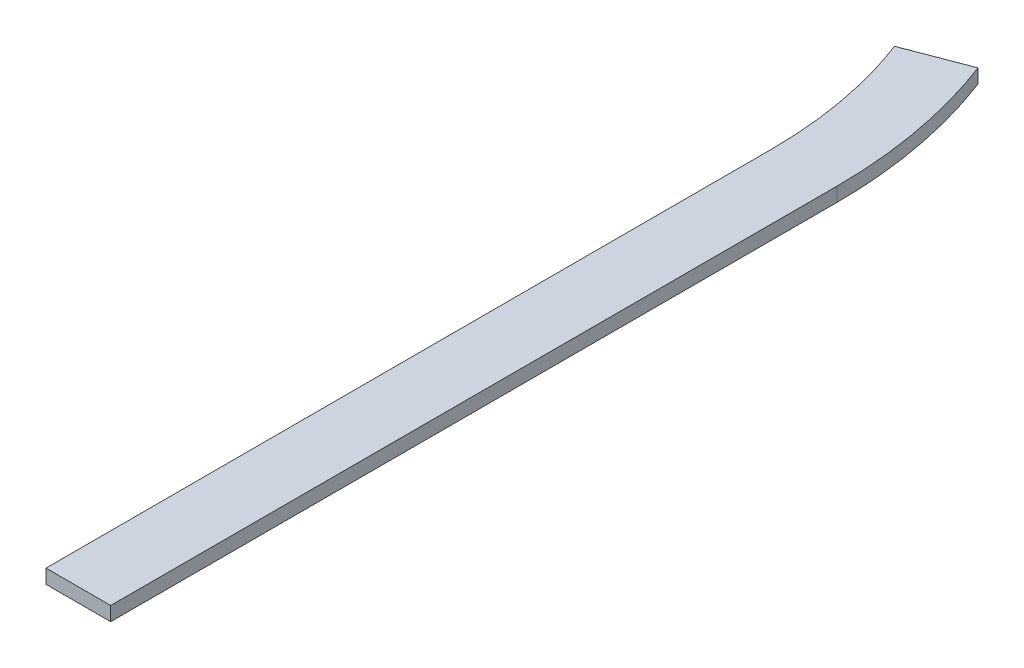
ISO-10303-21;
HEADER;
FILE_DESCRIPTION(('STEP AP214'),'2;1');
FILE_NAME('part.step','',(''),(''),'','','');
FILE_SCHEMA(('AUTOMOTIVE_DESIGN { 1 0 10303 214 1 1 1 1 }'));
ENDSEC;
DATA;
#1=APPLICATION_CONTEXT('core data for automotive mechanical design processes');
#2=APPLICATION_PROTOCOL_DEFINITION('international standard','automotive_design',2000,#1);
#3=PRODUCT_CONTEXT('',#1,'mechanical');
#4=PRODUCT('Part','Part','',(#3));
#5=PRODUCT_RELATED_PRODUCT_CATEGORY('part','',(#4));
#6=PRODUCT_DEFINITION_FORMATION('','',#4);
#7=PRODUCT_DEFINITION_CONTEXT('part definition',#1,'design');
#8=PRODUCT_DEFINITION('design','',#6,#7);
#9=PRODUCT_DEFINITION_SHAPE('','',#8);
#10=(LENGTH_UNIT() NAMED_UNIT(*) SI_UNIT(.MILLI.,.METRE.));
#11=(NAMED_UNIT(*) PLANE_ANGLE_UNIT() SI_UNIT($,.RADIAN.));
#12=(NAMED_UNIT(*) SI_UNIT($,.STERADIAN.) SOLID_ANGLE_UNIT());
#13=UNCERTAINTY_MEASURE_WITH_UNIT(LENGTH_MEASURE(1.E-05),#10,'distance_accuracy_value','');
#14=(GEOMETRIC_REPRESENTATION_CONTEXT(3) GLOBAL_UNCERTAINTY_ASSIGNED_CONTEXT((#13)) GLOBAL_UNIT_ASSIGNED_CONTEXT((#10,
#11,#12)) REPRESENTATION_CONTEXT('',''));
#15=CARTESIAN_POINT('',(0.,0.,0.));
#16=DIRECTION('',(0.,0.,1.));
#17=DIRECTION('',(1.,0.,0.));
#18=AXIS2_PLACEMENT_3D('',#15,#16,#17);
#19=CARTESIAN_POINT('',(206.7634030879,-1.580176254533,-73.80424301871));
#20=DIRECTION('',(-4.12520384996014E-05,-0.999999999149134,4.96867009670316E-08));
#21=DIRECTION('',(0.999999999149135,-4.12520384996014E-05,0.));
#22=AXIS2_PLACEMENT_3D('',#19,#20,#21);
#23=PLANE('',#22);
#24=CARTESIAN_POINT('',(205.25,-1.580094204042,-68.79760282041));
#25=DIRECTION('',(0.,3.85885871942688E-06,0.999999999992555));
#26=VECTOR('',#25,1.);
#27=LINE('',#24,#26);
#28=CARTESIAN_POINT('',(205.249996809631,-1.58010350419458,-68.7976028204096));
#29=VERTEX_POINT('',#28);
#30=CARTESIAN_POINT('',(205.249999997872,-1.57999516712894,-24.4496012387229));
#31=VERTEX_POINT('',#30);
#32=EDGE_CURVE('E119',#29,#31,#27,.T.);
#33=ORIENTED_EDGE('',*,*,#32,.F.);
#34=CARTESIAN_POINT('',(205.249993621801,-1.58011357454395,-68.797602820409));
#35=CARTESIAN_POINT('',(205.246957894945,-1.58011356575316,-71.1410696304133));
#36=CARTESIAN_POINT('',(204.821149913133,-1.58009611483444,-73.4460838514299));
#37=CARTESIAN_POINT('',(204.395440197118,-1.58007866794296,-75.7505661330083));
#38=CARTESIAN_POINT('',(203.560735978057,-1.58004434352429,-77.9409297364025));
#39=B_SPLINE_CURVE_WITH_KNOTS('',2,(#34,#35,#36,#37,#38),.UNSPECIFIED.,.F.,.F.,(3,2,3),(0.,0.5,
1.),.UNSPECIFIED.);
#40=CARTESIAN_POINT('',(203.560735977016,-1.58006927378314,-77.9409297364055));
#41=VERTEX_POINT('',#40);
#42=EDGE_CURVE('E81',#29,#41,#39,.T.);
#43=ORIENTED_EDGE('',*,*,#42,.T.);
#44=CARTESIAN_POINT('',(203.560735978053,-1.58004434352429,-77.9409297364229));
#45=DIRECTION('',(0.934447990868678,-3.85655779441479E-05,-0.356099636161268));
#46=VECTOR('',#45,1.);
#47=LINE('',#44,#46);
#48=CARTESIAN_POINT('',(207.25180554317,-1.58019772410409,-79.3475232994957));
#49=VERTEX_POINT('',#48);
#50=EDGE_CURVE('E77',#41,#49,#47,.T.);
#51=ORIENTED_EDGE('',*,*,#50,.T.);
#52=CARTESIAN_POINT('',(179.4799540302,-1.57905050621902,-68.76422031162));
#53=DIRECTION('',(-4.12520384996014E-05,-0.999999999149134,4.96867009670316E-08));
#54=DIRECTION('',(0.999999273780074,-4.12520684225755E-05,-0.00120446568680574));
#55=AXIS2_PLACEMENT_3D('',#52,#53,#54);
#56=ELLIPSE('',#55,29.7200612395378,29.72006121425);
#57=CARTESIAN_POINT('',(209.199995460072,-1.5802666161025,-68.800017104159));
#58=VERTEX_POINT('',#57);
#59=EDGE_CURVE('E97',#58,#49,#56,.F.);
#60=ORIENTED_EDGE('',*,*,#59,.F.);
#61=CARTESIAN_POINT('',(209.199993685625,-1.58027652021875,-68.8000171042191));
#62=DIRECTION('',(2.04962982566489E-12,4.96867009258006E-08,0.999999999999999));
#63=VECTOR('',#62,1.);
#64=LINE('',#61,#63);
#65=CARTESIAN_POINT('',(209.19999890136,-1.58010427239559,-24.4503876656404));
#66=VERTEX_POINT('',#65);
#67=EDGE_CURVE('E106',#58,#66,#64,.T.);
#68=ORIENTED_EDGE('',*,*,#67,.T.);
#69=CARTESIAN_POINT('',(205.2500000013,-1.57992306981699,-24.4499919380284));
#70=DIRECTION('',(0.999999999737355,-2.29178113806182E-05,2.52176409878877E-07));
#71=VECTOR('',#70,1.);
#72=LINE('',#69,#71);
#73=EDGE_CURVE('E112',#31,#66,#72,.T.);
#74=ORIENTED_EDGE('',*,*,#73,.F.);
#75=EDGE_LOOP('',(#33,#43,#51,#60,#68,#74));
#76=FACE_BOUND('',#75,.T.);
#77=ADVANCED_FACE('F17',(#76),#23,.T.);
#78=CARTESIAN_POINT('',(205.4062707594,-1.150131166822,-78.64422651801));
#79=DIRECTION('',(0.3560996362594,0.,0.934447991627101));
#80=DIRECTION('',(0.934447991627101,0.,-0.3560996362594));
#81=AXIS2_PLACEMENT_3D('',#78,#79,#80);
#82=PLANE('',#81);
#83=DIRECTION('',(0.,-1.,0.));
#84=VECTOR('',#83,1.);
#85=CARTESIAN_POINT('',(203.560735975967,-54.,-77.9409297363874));
#86=LINE('',#85,#84);
#87=CARTESIAN_POINT('',(203.560735975962,-0.720079910996421,-77.9409297364013));
#88=VERTEX_POINT('',#87);
#89=EDGE_CURVE('E74',#41,#88,#86,.F.);
#90=ORIENTED_EDGE('',*,*,#89,.T.);
#91=DIRECTION('',(-0.934447991409671,-2.15485539010966E-05,0.356099636177981));
#92=VECTOR('',#91,1.);
#93=CARTESIAN_POINT('',(207.251805542702,-0.7199947942085,-79.3475232995547));
#94=LINE('',#93,#92);
#95=CARTESIAN_POINT('',(207.251805542952,-0.719994794208494,-79.3475232994594));
#96=VERTEX_POINT('',#95);
#97=EDGE_CURVE('E70',#96,#88,#94,.T.);
#98=ORIENTED_EDGE('',*,*,#97,.F.);
#99=DIRECTION('',(0.,-1.,0.));
#100=VECTOR('',#99,1.);
#101=CARTESIAN_POINT('',(207.251805543016,-54.,-79.347523299293));
#102=LINE('',#101,#100);
#103=EDGE_CURVE('E95',#49,#96,#102,.F.);
#104=ORIENTED_EDGE('',*,*,#103,.F.);
#105=ORIENTED_EDGE('',*,*,#50,.F.);
#106=EDGE_LOOP('',(#90,#98,#104,#105));
#107=FACE_BOUND('',#106,.T.);
#108=ADVANCED_FACE('F76',(#107),#82,.F.);
#109=CARTESIAN_POINT('',(179.4799540302,-54.,-68.76422031162));
#110=DIRECTION('',(0.,-1.,0.));
#111=DIRECTION('',(0.,0.,-1.));
#112=AXIS2_PLACEMENT_3D('',#109,#110,#111);
#113=CYLINDRICAL_SURFACE('',#112,25.77006121425);
#114=ORIENTED_EDGE('',*,*,#42,.F.);
#115=CARTESIAN_POINT('',(205.25,-0.720137532641899,-68.79962060835));
#116=DIRECTION('',(0.,-0.99999724725416,0.00234637680321199));
#117=VECTOR('',#116,1.);
#118=LINE('',#115,#117);
#119=CARTESIAN_POINT('',(205.249995237592,-0.72012703981454,-68.7996206087271));
#120=VERTEX_POINT('',#119);
#121=EDGE_CURVE('E80',#120,#29,#118,.T.);
#122=ORIENTED_EDGE('',*,*,#121,.F.);
#123=CARTESIAN_POINT('',(179.4799540302,-0.720635218549655,-68.76422031162));
#124=DIRECTION('',(-2.01360029153206E-05,0.99999999976783,7.67343220608923E-06));
#125=DIRECTION('',(-0.934447991410102,-2.15485539010683E-05,0.356099636176851));
#126=AXIS2_PLACEMENT_3D('',#123,#124,#125);
#127=ELLIPSE('',#126,25.770061220233,25.77006121425);
#128=EDGE_CURVE('E84',#88,#120,#127,.F.);
#129=ORIENTED_EDGE('',*,*,#128,.F.);
#130=ORIENTED_EDGE('',*,*,#89,.F.);
#131=EDGE_LOOP('',(#114,#122,#129,#130));
#132=FACE_BOUND('',#131,.T.);
#133=ADVANCED_FACE('F85',(#132),#113,.F.);
#134=CARTESIAN_POINT('',(205.25,-54.,-68.8));
#135=DIRECTION('',(-1.,0.,0.));
#136=DIRECTION('',(0.,0.,1.));
#137=AXIS2_PLACEMENT_3D('',#134,#135,#136);
#138=PLANE('',#137);
#139=CARTESIAN_POINT('',(205.2500000013,-0.720329750697199,-24.4499919380284));
#140=DIRECTION('',(0.,-1.,0.));
#141=VECTOR('',#140,1.);
#142=LINE('',#139,#141);
#143=CARTESIAN_POINT('',(205.249997997535,-0.720393100265047,-24.4499919385476));
#144=VERTEX_POINT('',#143);
#145=EDGE_CURVE('E116',#144,#31,#142,.T.);
#146=ORIENTED_EDGE('',*,*,#145,.F.);
#147=DIRECTION('',(0.,-7.67343220764486E-06,0.999999999970559));
#148=VECTOR('',#147,1.);
#149=CARTESIAN_POINT('',(205.25,-0.720077638556195,-73.8042430189438));
#150=LINE('',#149,#148);
#151=EDGE_CURVE('E91',#120,#144,#150,.T.);
#152=ORIENTED_EDGE('',*,*,#151,.F.);
#153=ORIENTED_EDGE('',*,*,#121,.T.);
#154=ORIENTED_EDGE('',*,*,#32,.T.);
#155=EDGE_LOOP('',(#146,#152,#153,#154));
#156=FACE_BOUND('',#155,.T.);
#157=ADVANCED_FACE('F125',(#156),#138,.T.);
#158=CARTESIAN_POINT('',(207.2249999365,-1.14995097622,-24.44999143998));
#159=DIRECTION('',(-2.52176409949692E-07,0.,0.999999999999968));
#160=DIRECTION('',(0.999999999999968,0.,2.52176409949692E-07));
#161=AXIS2_PLACEMENT_3D('',#158,#159,#160);
#162=PLANE('',#161);
#163=ORIENTED_EDGE('',*,*,#73,.T.);
#164=CARTESIAN_POINT('',(209.2000000026,-1.580013595172,-24.4499909419316));
#165=DIRECTION('',(0.,1.,0.));
#166=VECTOR('',#165,1.);
#167=LINE('',#164,#166);
#168=CARTESIAN_POINT('',(209.200000002203,-0.720345972341426,-24.4499914266844));
#169=VERTEX_POINT('',#168);
#170=EDGE_CURVE('E104',#66,#169,#167,.T.);
#171=ORIENTED_EDGE('',*,*,#170,.T.);
#172=DIRECTION('',(-0.999999999797271,-2.01360029159134E-05,0.));
#173=VECTOR('',#172,1.);
#174=CARTESIAN_POINT('',(206.763403095526,-0.720425881166874,-24.4499919394114));
#175=LINE('',#174,#173);
#176=EDGE_CURVE('E255',#144,#169,#175,.F.);
#177=ORIENTED_EDGE('',*,*,#176,.F.);
#178=ORIENTED_EDGE('',*,*,#145,.T.);
#179=EDGE_LOOP('',(#163,#171,#177,#178));
#180=FACE_BOUND('',#179,.T.);
#181=ADVANCED_FACE('F144',(#180),#162,.T.);
#182=CARTESIAN_POINT('',(209.2,-54.,-68.8));
#183=DIRECTION('',(-1.,0.,0.));
#184=DIRECTION('',(0.,0.,1.));
#185=AXIS2_PLACEMENT_3D('',#182,#183,#184);
#186=PLANE('',#185);
#187=ORIENTED_EDGE('',*,*,#67,.F.);
#188=CARTESIAN_POINT('',(209.199993686439,-0.720004606273299,-68.80001710407));
#189=DIRECTION('',(0.,-1.,0.));
#190=VECTOR('',#189,1.);
#191=LINE('',#188,#190);
#192=CARTESIAN_POINT('',(209.199996842863,-0.720020553541467,-68.8000171041924));
#193=VERTEX_POINT('',#192);
#194=EDGE_CURVE('E36',#193,#58,#191,.T.);
#195=ORIENTED_EDGE('',*,*,#194,.F.);
#196=DIRECTION('',(1.54512253276877E-10,-7.6734322045336E-06,0.999999999970559));
#197=VECTOR('',#196,1.);
#198=CARTESIAN_POINT('',(209.199999996517,-0.719998101344733,-73.80424301871));
#199=LINE('',#198,#197);
#200=EDGE_CURVE('E27',#169,#193,#199,.F.);
#201=ORIENTED_EDGE('',*,*,#200,.F.);
#202=ORIENTED_EDGE('',*,*,#170,.F.);
#203=EDGE_LOOP('',(#187,#195,#201,#202));
#204=FACE_BOUND('',#203,.T.);
#205=ADVANCED_FACE('F207',(#204),#186,.F.);
#206=CARTESIAN_POINT('',(179.4799540302,-54.,-68.76422031162));
#207=DIRECTION('',(0.,-1.,0.));
#208=DIRECTION('',(0.,0.,-1.));
#209=AXIS2_PLACEMENT_3D('',#206,#207,#208);
#210=CYLINDRICAL_SURFACE('',#209,29.72006121425);
#211=ORIENTED_EDGE('',*,*,#103,.T.);
#212=CARTESIAN_POINT('',(179.4799540302,-0.720635218549655,-68.76422031162));
#213=DIRECTION('',(-2.01360029153206E-05,0.99999999976783,7.67343220608923E-06));
#214=DIRECTION('',(-0.934447991410102,-2.15485539010683E-05,0.356099636176851));
#215=AXIS2_PLACEMENT_3D('',#212,#213,#214);
#216=ELLIPSE('',#215,29.7200612211501,29.72006121425);
#217=EDGE_CURVE('E11',#193,#96,#216,.T.);
#218=ORIENTED_EDGE('',*,*,#217,.F.);
#219=ORIENTED_EDGE('',*,*,#194,.T.);
#220=ORIENTED_EDGE('',*,*,#59,.T.);
#221=EDGE_LOOP('',(#211,#218,#219,#220));
#222=FACE_BOUND('',#221,.T.);
#223=ADVANCED_FACE('F216',(#222),#210,.T.);
#224=CARTESIAN_POINT('',(206.7634030879,-0.7200471646672,-73.80424301871));
#225=DIRECTION('',(-2.01360029153206E-05,0.99999999976783,7.67343220608923E-06));
#226=DIRECTION('',(-0.999999999797271,-2.01360029159134E-05,0.));
#227=AXIS2_PLACEMENT_3D('',#224,#225,#226);
#228=PLANE('',#227);
#229=ORIENTED_EDGE('',*,*,#200,.T.);
#230=ORIENTED_EDGE('',*,*,#217,.T.);
#231=ORIENTED_EDGE('',*,*,#97,.T.);
#232=ORIENTED_EDGE('',*,*,#128,.T.);
#233=ORIENTED_EDGE('',*,*,#151,.T.);
#234=ORIENTED_EDGE('',*,*,#176,.T.);
#235=EDGE_LOOP('',(#229,#230,#231,#232,#233,#234));
#236=FACE_BOUND('',#235,.T.);
#237=ADVANCED_FACE('F94',(#236),#228,.T.);
#238=CLOSED_SHELL('',(#77,#108,#133,#157,#181,#205,#223,#237));
#239=MANIFOLD_SOLID_BREP('B1',#238);
#240=ADVANCED_BREP_SHAPE_REPRESENTATION('',(#18,#239),#14);
#241=SHAPE_DEFINITION_REPRESENTATION(#9,#240);
ENDSEC;
END-ISO-10303-21;
